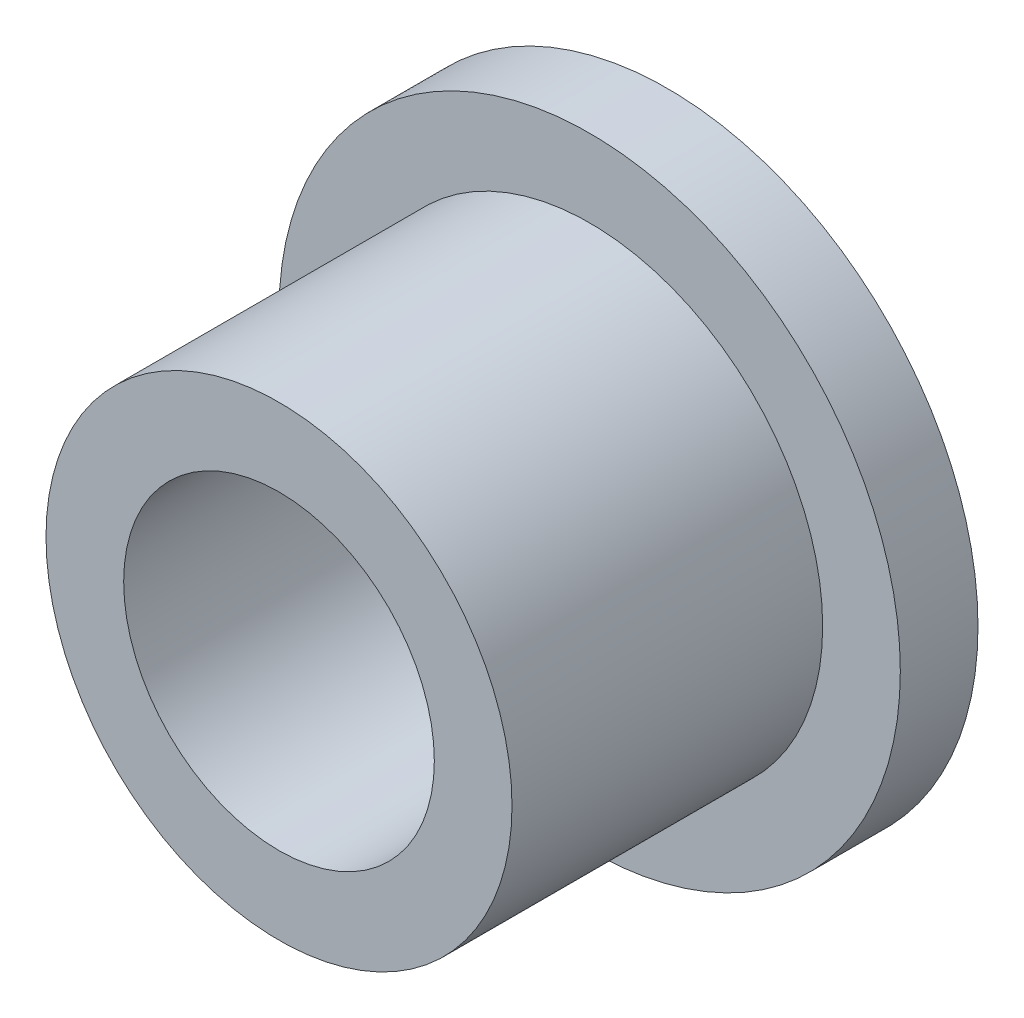
ISO-10303-21;
HEADER;
FILE_DESCRIPTION(('STEP AP214'),'2;1');
FILE_NAME('part.step','',(''),(''),'','','');
FILE_SCHEMA(('AUTOMOTIVE_DESIGN { 1 0 10303 214 1 1 1 1 }'));
ENDSEC;
DATA;
#1=APPLICATION_CONTEXT('core data for automotive mechanical design processes');
#2=APPLICATION_PROTOCOL_DEFINITION('international standard','automotive_design',2000,#1);
#3=PRODUCT_CONTEXT('',#1,'mechanical');
#4=PRODUCT('Part','Part','',(#3));
#5=PRODUCT_RELATED_PRODUCT_CATEGORY('part','',(#4));
#6=PRODUCT_DEFINITION_FORMATION('','',#4);
#7=PRODUCT_DEFINITION_CONTEXT('part definition',#1,'design');
#8=PRODUCT_DEFINITION('design','',#6,#7);
#9=PRODUCT_DEFINITION_SHAPE('','',#8);
#10=(LENGTH_UNIT() NAMED_UNIT(*) SI_UNIT(.MILLI.,.METRE.));
#11=(NAMED_UNIT(*) PLANE_ANGLE_UNIT() SI_UNIT($,.RADIAN.));
#12=(NAMED_UNIT(*) SI_UNIT($,.STERADIAN.) SOLID_ANGLE_UNIT());
#13=UNCERTAINTY_MEASURE_WITH_UNIT(LENGTH_MEASURE(1.E-05),#10,'distance_accuracy_value','');
#14=(GEOMETRIC_REPRESENTATION_CONTEXT(3) GLOBAL_UNCERTAINTY_ASSIGNED_CONTEXT((#13)) GLOBAL_UNIT_ASSIGNED_CONTEXT((#10,
#11,#12)) REPRESENTATION_CONTEXT('',''));
#15=CARTESIAN_POINT('',(0.,0.,0.));
#16=DIRECTION('',(0.,0.,1.));
#17=DIRECTION('',(1.,0.,0.));
#18=AXIS2_PLACEMENT_3D('',#15,#16,#17);
#19=CARTESIAN_POINT('',(0.,0.,1.5875));
#20=DIRECTION('',(0.,0.,1.));
#21=DIRECTION('',(1.,0.,0.));
#22=AXIS2_PLACEMENT_3D('',#19,#20,#21);
#23=PLANE('',#22);
#24=CARTESIAN_POINT('',(0.,0.,1.5875));
#25=DIRECTION('',(0.,0.,1.));
#26=DIRECTION('',(1.,0.,0.));
#27=AXIS2_PLACEMENT_3D('',#24,#25,#26);
#28=CIRCLE('',#27,6.35);
#29=CARTESIAN_POINT('',(6.35,0.,1.5875));
#30=VERTEX_POINT('',#29);
#31=EDGE_CURVE('E10',#30,#30,#28,.T.);
#32=ORIENTED_EDGE('',*,*,#31,.T.);
#33=EDGE_LOOP('',(#32));
#34=FACE_BOUND('',#33,.T.);
#35=CARTESIAN_POINT('',(0.,0.,1.5875));
#36=DIRECTION('',(0.,0.,1.));
#37=DIRECTION('',(1.,0.,0.));
#38=AXIS2_PLACEMENT_3D('',#35,#36,#37);
#39=CIRCLE('',#38,4.7625);
#40=CARTESIAN_POINT('',(4.7625,0.,1.5875));
#41=VERTEX_POINT('',#40);
#42=EDGE_CURVE('E48',#41,#41,#39,.T.);
#43=ORIENTED_EDGE('',*,*,#42,.F.);
#44=EDGE_LOOP('',(#43));
#45=FACE_BOUND('',#44,.T.);
#46=ADVANCED_FACE('F32',(#34,#45),#23,.T.);
#47=CARTESIAN_POINT('',(0.,0.,0.));
#48=DIRECTION('',(0.,0.,1.));
#49=DIRECTION('',(1.,0.,0.));
#50=AXIS2_PLACEMENT_3D('',#47,#48,#49);
#51=PLANE('',#50);
#52=CARTESIAN_POINT('',(0.,0.,0.));
#53=DIRECTION('',(0.,0.,1.));
#54=DIRECTION('',(1.,0.,0.));
#55=AXIS2_PLACEMENT_3D('',#52,#53,#54);
#56=CIRCLE('',#55,6.35);
#57=CARTESIAN_POINT('',(6.35,0.,0.));
#58=VERTEX_POINT('',#57);
#59=EDGE_CURVE('E36',#58,#58,#56,.T.);
#60=ORIENTED_EDGE('',*,*,#59,.F.);
#61=EDGE_LOOP('',(#60));
#62=FACE_BOUND('',#61,.T.);
#63=CARTESIAN_POINT('',(0.,0.,0.));
#64=DIRECTION('',(0.,0.,1.));
#65=DIRECTION('',(1.,0.,0.));
#66=AXIS2_PLACEMENT_3D('',#63,#64,#65);
#67=CIRCLE('',#66,3.175);
#68=CARTESIAN_POINT('',(3.175,0.,0.));
#69=VERTEX_POINT('',#68);
#70=EDGE_CURVE('E43',#69,#69,#67,.T.);
#71=ORIENTED_EDGE('',*,*,#70,.T.);
#72=EDGE_LOOP('',(#71));
#73=FACE_BOUND('',#72,.T.);
#74=ADVANCED_FACE('F73',(#62,#73),#51,.F.);
#75=CARTESIAN_POINT('',(0.,0.,1.5875));
#76=DIRECTION('',(0.,0.,-1.));
#77=DIRECTION('',(-1.,0.,0.));
#78=AXIS2_PLACEMENT_3D('',#75,#76,#77);
#79=CYLINDRICAL_SURFACE('',#78,6.35);
#80=ORIENTED_EDGE('',*,*,#31,.F.);
#81=EDGE_LOOP('',(#80));
#82=FACE_BOUND('',#81,.T.);
#83=ORIENTED_EDGE('',*,*,#59,.T.);
#84=EDGE_LOOP('',(#83));
#85=FACE_BOUND('',#84,.T.);
#86=ADVANCED_FACE('F34',(#82,#85),#79,.T.);
#87=CARTESIAN_POINT('',(0.,0.,1.5875));
#88=DIRECTION('',(0.,0.,-1.));
#89=DIRECTION('',(-1.,0.,0.));
#90=AXIS2_PLACEMENT_3D('',#87,#88,#89);
#91=CYLINDRICAL_SURFACE('',#90,3.175);
#92=ORIENTED_EDGE('',*,*,#70,.F.);
#93=EDGE_LOOP('',(#92));
#94=FACE_BOUND('',#93,.T.);
#95=CARTESIAN_POINT('',(0.,0.,7.9375));
#96=DIRECTION('',(0.,0.,1.));
#97=DIRECTION('',(1.,0.,0.));
#98=AXIS2_PLACEMENT_3D('',#95,#96,#97);
#99=CIRCLE('',#98,3.175);
#100=CARTESIAN_POINT('',(3.175,0.,7.9375));
#101=VERTEX_POINT('',#100);
#102=EDGE_CURVE('E51',#101,#101,#99,.T.);
#103=ORIENTED_EDGE('',*,*,#102,.T.);
#104=EDGE_LOOP('',(#103));
#105=FACE_BOUND('',#104,.T.);
#106=ADVANCED_FACE('F57',(#94,#105),#91,.F.);
#107=CARTESIAN_POINT('',(0.,0.,7.9375));
#108=DIRECTION('',(0.,0.,1.));
#109=DIRECTION('',(1.,0.,0.));
#110=AXIS2_PLACEMENT_3D('',#107,#108,#109);
#111=PLANE('',#110);
#112=CARTESIAN_POINT('',(0.,0.,7.9375));
#113=DIRECTION('',(0.,0.,1.));
#114=DIRECTION('',(1.,0.,0.));
#115=AXIS2_PLACEMENT_3D('',#112,#113,#114);
#116=CIRCLE('',#115,4.7625);
#117=CARTESIAN_POINT('',(4.7625,0.,7.9375));
#118=VERTEX_POINT('',#117);
#119=EDGE_CURVE('E47',#118,#118,#116,.T.);
#120=ORIENTED_EDGE('',*,*,#119,.T.);
#121=EDGE_LOOP('',(#120));
#122=FACE_BOUND('',#121,.T.);
#123=ORIENTED_EDGE('',*,*,#102,.F.);
#124=EDGE_LOOP('',(#123));
#125=FACE_BOUND('',#124,.T.);
#126=ADVANCED_FACE('F59',(#122,#125),#111,.T.);
#127=CARTESIAN_POINT('',(0.,0.,7.9375));
#128=DIRECTION('',(0.,0.,-1.));
#129=DIRECTION('',(-1.,0.,0.));
#130=AXIS2_PLACEMENT_3D('',#127,#128,#129);
#131=CYLINDRICAL_SURFACE('',#130,4.7625);
#132=ORIENTED_EDGE('',*,*,#119,.F.);
#133=EDGE_LOOP('',(#132));
#134=FACE_BOUND('',#133,.T.);
#135=ORIENTED_EDGE('',*,*,#42,.T.);
#136=EDGE_LOOP('',(#135));
#137=FACE_BOUND('',#136,.T.);
#138=ADVANCED_FACE('F61',(#134,#137),#131,.T.);
#139=CLOSED_SHELL('',(#46,#74,#86,#106,#126,#138));
#140=MANIFOLD_SOLID_BREP('B2',#139);
#141=ADVANCED_BREP_SHAPE_REPRESENTATION('',(#18,#140),#14);
#142=SHAPE_DEFINITION_REPRESENTATION(#9,#141);
ENDSEC;
END-ISO-10303-21;
